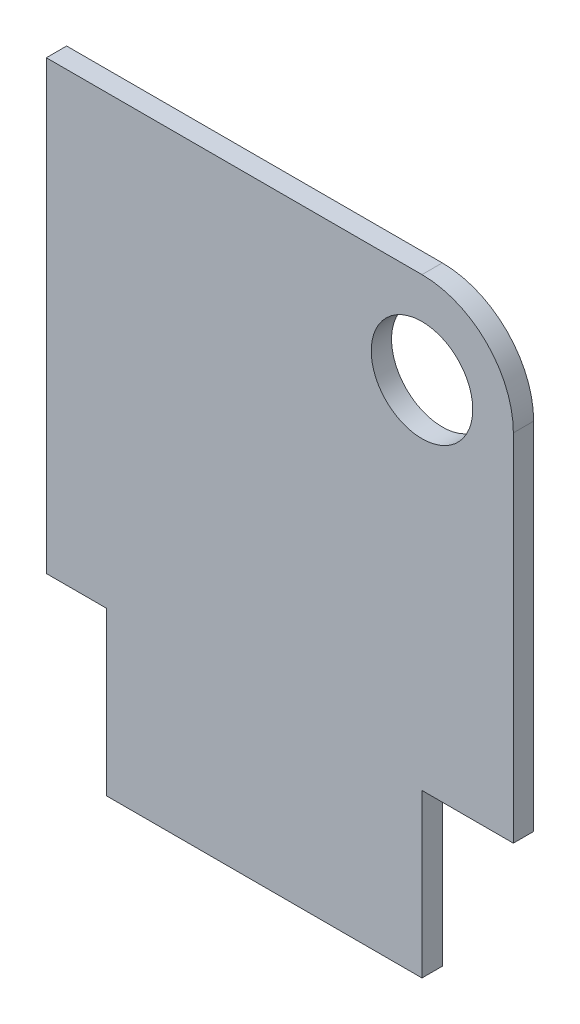
ISO-10303-21;
HEADER;
FILE_DESCRIPTION(('STEP AP214'),'2;1');
FILE_NAME('part.step','',(''),(''),'','','');
FILE_SCHEMA(('AUTOMOTIVE_DESIGN { 1 0 10303 214 1 1 1 1 }'));
ENDSEC;
DATA;
#1=APPLICATION_CONTEXT('core data for automotive mechanical design processes');
#2=APPLICATION_PROTOCOL_DEFINITION('international standard','automotive_design',2000,#1);
#3=PRODUCT_CONTEXT('',#1,'mechanical');
#4=PRODUCT('Part','Part','',(#3));
#5=PRODUCT_RELATED_PRODUCT_CATEGORY('part','',(#4));
#6=PRODUCT_DEFINITION_FORMATION('','',#4);
#7=PRODUCT_DEFINITION_CONTEXT('part definition',#1,'design');
#8=PRODUCT_DEFINITION('design','',#6,#7);
#9=PRODUCT_DEFINITION_SHAPE('','',#8);
#10=(LENGTH_UNIT() NAMED_UNIT(*) SI_UNIT(.MILLI.,.METRE.));
#11=(NAMED_UNIT(*) PLANE_ANGLE_UNIT() SI_UNIT($,.RADIAN.));
#12=(NAMED_UNIT(*) SI_UNIT($,.STERADIAN.) SOLID_ANGLE_UNIT());
#13=UNCERTAINTY_MEASURE_WITH_UNIT(LENGTH_MEASURE(1.E-05),#10,'distance_accuracy_value','');
#14=(GEOMETRIC_REPRESENTATION_CONTEXT(3) GLOBAL_UNCERTAINTY_ASSIGNED_CONTEXT((#13)) GLOBAL_UNIT_ASSIGNED_CONTEXT((#10,
#11,#12)) REPRESENTATION_CONTEXT('',''));
#15=CARTESIAN_POINT('',(0.,0.,0.));
#16=DIRECTION('',(0.,0.,1.));
#17=DIRECTION('',(1.,0.,0.));
#18=AXIS2_PLACEMENT_3D('',#15,#16,#17);
#19=CARTESIAN_POINT('',(0.,0.,10.));
#20=DIRECTION('',(-1.,0.,0.));
#21=DIRECTION('',(0.,0.,1.));
#22=AXIS2_PLACEMENT_3D('',#19,#20,#21);
#23=PLANE('',#22);
#24=DIRECTION('',(0.,1.,0.));
#25=VECTOR('',#24,1.);
#26=CARTESIAN_POINT('',(0.,0.,0.));
#27=LINE('',#26,#25);
#28=CARTESIAN_POINT('',(0.,80.,0.));
#29=VERTEX_POINT('',#28);
#30=CARTESIAN_POINT('',(0.,255.,0.));
#31=VERTEX_POINT('',#30);
#32=EDGE_CURVE('E155',#29,#31,#27,.T.);
#33=ORIENTED_EDGE('',*,*,#32,.T.);
#34=DIRECTION('',(0.,0.,-1.));
#35=VECTOR('',#34,1.);
#36=CARTESIAN_POINT('',(0.,255.,10.));
#37=LINE('',#36,#35);
#38=CARTESIAN_POINT('',(0.,255.,10.));
#39=VERTEX_POINT('',#38);
#40=EDGE_CURVE('E11',#39,#31,#37,.T.);
#41=ORIENTED_EDGE('',*,*,#40,.F.);
#42=DIRECTION('',(0.,1.,0.));
#43=VECTOR('',#42,1.);
#44=CARTESIAN_POINT('',(0.,0.,10.));
#45=LINE('',#44,#43);
#46=CARTESIAN_POINT('',(0.,80.,10.));
#47=VERTEX_POINT('',#46);
#48=EDGE_CURVE('E227',#47,#39,#45,.T.);
#49=ORIENTED_EDGE('',*,*,#48,.F.);
#50=DIRECTION('',(0.,0.,-1.));
#51=VECTOR('',#50,1.);
#52=CARTESIAN_POINT('',(0.,80.,10.));
#53=LINE('',#52,#51);
#54=EDGE_CURVE('E150',#47,#29,#53,.T.);
#55=ORIENTED_EDGE('',*,*,#54,.T.);
#56=EDGE_LOOP('',(#33,#41,#49,#55));
#57=FACE_BOUND('',#56,.T.);
#58=ADVANCED_FACE('F41',(#57),#23,.F.);
#59=CARTESIAN_POINT('',(-45.,255.,10.));
#60=DIRECTION('',(0.,0.,-1.));
#61=DIRECTION('',(-1.,0.,0.));
#62=AXIS2_PLACEMENT_3D('',#59,#60,#61);
#63=CYLINDRICAL_SURFACE('',#62,45.);
#64=CARTESIAN_POINT('',(-45.,255.,0.));
#65=DIRECTION('',(0.,0.,1.));
#66=DIRECTION('',(1.,0.,0.));
#67=AXIS2_PLACEMENT_3D('',#64,#65,#66);
#68=CIRCLE('',#67,45.);
#69=CARTESIAN_POINT('',(-45.,300.,0.));
#70=VERTEX_POINT('',#69);
#71=EDGE_CURVE('E159',#31,#70,#68,.T.);
#72=ORIENTED_EDGE('',*,*,#71,.T.);
#73=DIRECTION('',(0.,0.,-1.));
#74=VECTOR('',#73,1.);
#75=CARTESIAN_POINT('',(-45.,300.,10.));
#76=LINE('',#75,#74);
#77=CARTESIAN_POINT('',(-45.,300.,10.));
#78=VERTEX_POINT('',#77);
#79=EDGE_CURVE('E51',#78,#70,#76,.T.);
#80=ORIENTED_EDGE('',*,*,#79,.F.);
#81=CARTESIAN_POINT('',(-45.,255.,10.));
#82=DIRECTION('',(0.,0.,1.));
#83=DIRECTION('',(1.,0.,0.));
#84=AXIS2_PLACEMENT_3D('',#81,#82,#83);
#85=CIRCLE('',#84,45.);
#86=EDGE_CURVE('E104',#39,#78,#85,.T.);
#87=ORIENTED_EDGE('',*,*,#86,.F.);
#88=ORIENTED_EDGE('',*,*,#40,.T.);
#89=EDGE_LOOP('',(#72,#80,#87,#88));
#90=FACE_BOUND('',#89,.T.);
#91=ADVANCED_FACE('F247',(#90),#63,.T.);
#92=CARTESIAN_POINT('',(0.,300.,10.));
#93=DIRECTION('',(0.,-1.,0.));
#94=DIRECTION('',(1.,0.,0.));
#95=AXIS2_PLACEMENT_3D('',#92,#93,#94);
#96=PLANE('',#95);
#97=DIRECTION('',(-1.,0.,0.));
#98=VECTOR('',#97,1.);
#99=CARTESIAN_POINT('',(0.,300.,0.));
#100=LINE('',#99,#98);
#101=CARTESIAN_POINT('',(-230.,300.,0.));
#102=VERTEX_POINT('',#101);
#103=EDGE_CURVE('E162',#70,#102,#100,.T.);
#104=ORIENTED_EDGE('',*,*,#103,.T.);
#105=DIRECTION('',(0.,0.,-1.));
#106=VECTOR('',#105,1.);
#107=CARTESIAN_POINT('',(-230.,300.,10.));
#108=LINE('',#107,#106);
#109=CARTESIAN_POINT('',(-230.,300.,10.));
#110=VERTEX_POINT('',#109);
#111=EDGE_CURVE('E197',#110,#102,#108,.T.);
#112=ORIENTED_EDGE('',*,*,#111,.F.);
#113=DIRECTION('',(-1.,0.,0.));
#114=VECTOR('',#113,1.);
#115=CARTESIAN_POINT('',(0.,300.,10.));
#116=LINE('',#115,#114);
#117=EDGE_CURVE('E206',#78,#110,#116,.T.);
#118=ORIENTED_EDGE('',*,*,#117,.F.);
#119=ORIENTED_EDGE('',*,*,#79,.T.);
#120=EDGE_LOOP('',(#104,#112,#118,#119));
#121=FACE_BOUND('',#120,.T.);
#122=ADVANCED_FACE('F204',(#121),#96,.F.);
#123=CARTESIAN_POINT('',(-230.,0.,10.));
#124=DIRECTION('',(-1.,0.,0.));
#125=DIRECTION('',(0.,0.,1.));
#126=AXIS2_PLACEMENT_3D('',#123,#124,#125);
#127=PLANE('',#126);
#128=DIRECTION('',(0.,1.,0.));
#129=VECTOR('',#128,1.);
#130=CARTESIAN_POINT('',(-230.,0.,0.));
#131=LINE('',#130,#129);
#132=CARTESIAN_POINT('',(-230.,80.,0.));
#133=VERTEX_POINT('',#132);
#134=EDGE_CURVE('E166',#133,#102,#131,.T.);
#135=ORIENTED_EDGE('',*,*,#134,.F.);
#136=DIRECTION('',(0.,0.,-1.));
#137=VECTOR('',#136,1.);
#138=CARTESIAN_POINT('',(-230.,80.,10.));
#139=LINE('',#138,#137);
#140=CARTESIAN_POINT('',(-230.,80.,10.));
#141=VERTEX_POINT('',#140);
#142=EDGE_CURVE('E194',#141,#133,#139,.T.);
#143=ORIENTED_EDGE('',*,*,#142,.F.);
#144=DIRECTION('',(0.,1.,0.));
#145=VECTOR('',#144,1.);
#146=CARTESIAN_POINT('',(-230.,0.,10.));
#147=LINE('',#146,#145);
#148=EDGE_CURVE('E218',#141,#110,#147,.T.);
#149=ORIENTED_EDGE('',*,*,#148,.T.);
#150=ORIENTED_EDGE('',*,*,#111,.T.);
#151=EDGE_LOOP('',(#135,#143,#149,#150));
#152=FACE_BOUND('',#151,.T.);
#153=ADVANCED_FACE('F214',(#152),#127,.T.);
#154=CARTESIAN_POINT('',(0.,80.,10.));
#155=DIRECTION('',(0.,1.,0.));
#156=DIRECTION('',(0.,0.,1.));
#157=AXIS2_PLACEMENT_3D('',#154,#155,#156);
#158=PLANE('',#157);
#159=DIRECTION('',(1.,0.,0.));
#160=VECTOR('',#159,1.);
#161=CARTESIAN_POINT('',(0.,80.,0.));
#162=LINE('',#161,#160);
#163=CARTESIAN_POINT('',(-200.352260948772,80.,0.));
#164=VERTEX_POINT('',#163);
#165=EDGE_CURVE('E170',#133,#164,#162,.T.);
#166=ORIENTED_EDGE('',*,*,#165,.T.);
#167=DIRECTION('',(0.,0.,-1.));
#168=VECTOR('',#167,1.);
#169=CARTESIAN_POINT('',(-200.352260948772,80.,10.));
#170=LINE('',#169,#168);
#171=CARTESIAN_POINT('',(-200.352260948772,80.,10.));
#172=VERTEX_POINT('',#171);
#173=EDGE_CURVE('E190',#172,#164,#170,.T.);
#174=ORIENTED_EDGE('',*,*,#173,.F.);
#175=DIRECTION('',(1.,0.,0.));
#176=VECTOR('',#175,1.);
#177=CARTESIAN_POINT('',(0.,80.,10.));
#178=LINE('',#177,#176);
#179=EDGE_CURVE('E144',#141,#172,#178,.T.);
#180=ORIENTED_EDGE('',*,*,#179,.F.);
#181=ORIENTED_EDGE('',*,*,#142,.T.);
#182=EDGE_LOOP('',(#166,#174,#180,#181));
#183=FACE_BOUND('',#182,.T.);
#184=ADVANCED_FACE('F258',(#183),#158,.F.);
#185=CARTESIAN_POINT('',(-200.352260948772,0.,10.));
#186=DIRECTION('',(1.,0.,0.));
#187=DIRECTION('',(0.,0.,-1.));
#188=AXIS2_PLACEMENT_3D('',#185,#186,#187);
#189=PLANE('',#188);
#190=DIRECTION('',(0.,-1.,0.));
#191=VECTOR('',#190,1.);
#192=CARTESIAN_POINT('',(-200.352260948772,0.,0.));
#193=LINE('',#192,#191);
#194=CARTESIAN_POINT('',(-200.352260948772,0.,0.));
#195=VERTEX_POINT('',#194);
#196=EDGE_CURVE('E173',#164,#195,#193,.T.);
#197=ORIENTED_EDGE('',*,*,#196,.T.);
#198=DIRECTION('',(0.,0.,-1.));
#199=VECTOR('',#198,1.);
#200=CARTESIAN_POINT('',(-200.352260948772,0.,10.));
#201=LINE('',#200,#199);
#202=CARTESIAN_POINT('',(-200.352260948772,0.,10.));
#203=VERTEX_POINT('',#202);
#204=EDGE_CURVE('E130',#203,#195,#201,.T.);
#205=ORIENTED_EDGE('',*,*,#204,.F.);
#206=DIRECTION('',(0.,-1.,0.));
#207=VECTOR('',#206,1.);
#208=CARTESIAN_POINT('',(-200.352260948772,0.,10.));
#209=LINE('',#208,#207);
#210=EDGE_CURVE('E139',#172,#203,#209,.T.);
#211=ORIENTED_EDGE('',*,*,#210,.F.);
#212=ORIENTED_EDGE('',*,*,#173,.T.);
#213=EDGE_LOOP('',(#197,#205,#211,#212));
#214=FACE_BOUND('',#213,.T.);
#215=ADVANCED_FACE('F261',(#214),#189,.F.);
#216=CARTESIAN_POINT('',(0.,0.,10.));
#217=DIRECTION('',(0.,-1.,0.));
#218=DIRECTION('',(0.,0.,-1.));
#219=AXIS2_PLACEMENT_3D('',#216,#217,#218);
#220=PLANE('',#219);
#221=DIRECTION('',(-1.,0.,0.));
#222=VECTOR('',#221,1.);
#223=CARTESIAN_POINT('',(0.,0.,0.));
#224=LINE('',#223,#222);
#225=CARTESIAN_POINT('',(-45.,0.,0.));
#226=VERTEX_POINT('',#225);
#227=EDGE_CURVE('E128',#226,#195,#224,.T.);
#228=ORIENTED_EDGE('',*,*,#227,.F.);
#229=DIRECTION('',(0.,0.,-1.));
#230=VECTOR('',#229,1.);
#231=CARTESIAN_POINT('',(-45.,0.,10.));
#232=LINE('',#231,#230);
#233=CARTESIAN_POINT('',(-45.,0.,10.));
#234=VERTEX_POINT('',#233);
#235=EDGE_CURVE('E122',#234,#226,#232,.T.);
#236=ORIENTED_EDGE('',*,*,#235,.F.);
#237=DIRECTION('',(-1.,0.,0.));
#238=VECTOR('',#237,1.);
#239=CARTESIAN_POINT('',(0.,0.,10.));
#240=LINE('',#239,#238);
#241=EDGE_CURVE('E126',#234,#203,#240,.T.);
#242=ORIENTED_EDGE('',*,*,#241,.T.);
#243=ORIENTED_EDGE('',*,*,#204,.T.);
#244=EDGE_LOOP('',(#228,#236,#242,#243));
#245=FACE_BOUND('',#244,.T.);
#246=ADVANCED_FACE('F124',(#245),#220,.T.);
#247=CARTESIAN_POINT('',(-45.,0.,10.));
#248=DIRECTION('',(-1.,0.,0.));
#249=DIRECTION('',(0.,0.,1.));
#250=AXIS2_PLACEMENT_3D('',#247,#248,#249);
#251=PLANE('',#250);
#252=DIRECTION('',(0.,1.,0.));
#253=VECTOR('',#252,1.);
#254=CARTESIAN_POINT('',(-45.,0.,0.));
#255=LINE('',#254,#253);
#256=CARTESIAN_POINT('',(-45.,80.,0.));
#257=VERTEX_POINT('',#256);
#258=EDGE_CURVE('E90',#226,#257,#255,.T.);
#259=ORIENTED_EDGE('',*,*,#258,.T.);
#260=DIRECTION('',(0.,0.,-1.));
#261=VECTOR('',#260,1.);
#262=CARTESIAN_POINT('',(-45.,80.,10.));
#263=LINE('',#262,#261);
#264=CARTESIAN_POINT('',(-45.,80.,10.));
#265=VERTEX_POINT('',#264);
#266=EDGE_CURVE('E131',#265,#257,#263,.T.);
#267=ORIENTED_EDGE('',*,*,#266,.F.);
#268=DIRECTION('',(0.,1.,0.));
#269=VECTOR('',#268,1.);
#270=CARTESIAN_POINT('',(-45.,0.,10.));
#271=LINE('',#270,#269);
#272=EDGE_CURVE('E133',#234,#265,#271,.T.);
#273=ORIENTED_EDGE('',*,*,#272,.F.);
#274=ORIENTED_EDGE('',*,*,#235,.T.);
#275=EDGE_LOOP('',(#259,#267,#273,#274));
#276=FACE_BOUND('',#275,.T.);
#277=ADVANCED_FACE('F134',(#276),#251,.F.);
#278=CARTESIAN_POINT('',(-45.,255.,10.));
#279=DIRECTION('',(0.,0.,-1.));
#280=DIRECTION('',(-1.,0.,0.));
#281=AXIS2_PLACEMENT_3D('',#278,#279,#280);
#282=CYLINDRICAL_SURFACE('',#281,25.);
#283=CARTESIAN_POINT('',(-45.,255.,10.));
#284=DIRECTION('',(0.,0.,1.));
#285=DIRECTION('',(1.,0.,0.));
#286=AXIS2_PLACEMENT_3D('',#283,#284,#285);
#287=CIRCLE('',#286,25.);
#288=CARTESIAN_POINT('',(-20.,255.,10.));
#289=VERTEX_POINT('',#288);
#290=EDGE_CURVE('E183',#289,#289,#287,.T.);
#291=ORIENTED_EDGE('',*,*,#290,.T.);
#292=EDGE_LOOP('',(#291));
#293=FACE_BOUND('',#292,.T.);
#294=CARTESIAN_POINT('',(-45.,255.,0.));
#295=DIRECTION('',(0.,0.,1.));
#296=DIRECTION('',(1.,0.,0.));
#297=AXIS2_PLACEMENT_3D('',#294,#295,#296);
#298=CIRCLE('',#297,25.);
#299=CARTESIAN_POINT('',(-20.,255.,0.));
#300=VERTEX_POINT('',#299);
#301=EDGE_CURVE('E151',#300,#300,#298,.T.);
#302=ORIENTED_EDGE('',*,*,#301,.F.);
#303=EDGE_LOOP('',(#302));
#304=FACE_BOUND('',#303,.T.);
#305=ADVANCED_FACE('F43',(#293,#304),#282,.F.);
#306=CARTESIAN_POINT('',(0.,80.,10.));
#307=DIRECTION('',(0.,1.,0.));
#308=DIRECTION('',(0.,0.,1.));
#309=AXIS2_PLACEMENT_3D('',#306,#307,#308);
#310=PLANE('',#309);
#311=DIRECTION('',(1.,0.,0.));
#312=VECTOR('',#311,1.);
#313=CARTESIAN_POINT('',(0.,80.,0.));
#314=LINE('',#313,#312);
#315=EDGE_CURVE('E96',#257,#29,#314,.T.);
#316=ORIENTED_EDGE('',*,*,#315,.T.);
#317=ORIENTED_EDGE('',*,*,#54,.F.);
#318=DIRECTION('',(1.,0.,0.));
#319=VECTOR('',#318,1.);
#320=CARTESIAN_POINT('',(0.,80.,10.));
#321=LINE('',#320,#319);
#322=EDGE_CURVE('E59',#265,#47,#321,.T.);
#323=ORIENTED_EDGE('',*,*,#322,.F.);
#324=ORIENTED_EDGE('',*,*,#266,.T.);
#325=EDGE_LOOP('',(#316,#317,#323,#324));
#326=FACE_BOUND('',#325,.T.);
#327=ADVANCED_FACE('F237',(#326),#310,.F.);
#328=CARTESIAN_POINT('',(0.,0.,10.));
#329=DIRECTION('',(0.,0.,1.));
#330=DIRECTION('',(1.,0.,0.));
#331=AXIS2_PLACEMENT_3D('',#328,#329,#330);
#332=PLANE('',#331);
#333=ORIENTED_EDGE('',*,*,#290,.F.);
#334=EDGE_LOOP('',(#333));
#335=FACE_BOUND('',#334,.T.);
#336=ORIENTED_EDGE('',*,*,#48,.T.);
#337=ORIENTED_EDGE('',*,*,#86,.T.);
#338=ORIENTED_EDGE('',*,*,#117,.T.);
#339=ORIENTED_EDGE('',*,*,#148,.F.);
#340=ORIENTED_EDGE('',*,*,#179,.T.);
#341=ORIENTED_EDGE('',*,*,#210,.T.);
#342=ORIENTED_EDGE('',*,*,#241,.F.);
#343=ORIENTED_EDGE('',*,*,#272,.T.);
#344=ORIENTED_EDGE('',*,*,#322,.T.);
#345=EDGE_LOOP('',(#336,#337,#338,#339,#340,#341,#342,#343,#344));
#346=FACE_BOUND('',#345,.T.);
#347=ADVANCED_FACE('F137',(#335,#346),#332,.T.);
#348=CARTESIAN_POINT('',(0.,0.,0.));
#349=DIRECTION('',(0.,0.,1.));
#350=DIRECTION('',(1.,0.,0.));
#351=AXIS2_PLACEMENT_3D('',#348,#349,#350);
#352=PLANE('',#351);
#353=ORIENTED_EDGE('',*,*,#301,.T.);
#354=EDGE_LOOP('',(#353));
#355=FACE_BOUND('',#354,.T.);
#356=ORIENTED_EDGE('',*,*,#32,.F.);
#357=ORIENTED_EDGE('',*,*,#315,.F.);
#358=ORIENTED_EDGE('',*,*,#258,.F.);
#359=ORIENTED_EDGE('',*,*,#227,.T.);
#360=ORIENTED_EDGE('',*,*,#196,.F.);
#361=ORIENTED_EDGE('',*,*,#165,.F.);
#362=ORIENTED_EDGE('',*,*,#134,.T.);
#363=ORIENTED_EDGE('',*,*,#103,.F.);
#364=ORIENTED_EDGE('',*,*,#71,.F.);
#365=EDGE_LOOP('',(#356,#357,#358,#359,#360,#361,#362,#363,#364));
#366=FACE_BOUND('',#365,.T.);
#367=ADVANCED_FACE('F209',(#355,#366),#352,.F.);
#368=CLOSED_SHELL('',(#58,#91,#122,#153,#184,#215,#246,#277,#305,#327,#347,#367));
#369=MANIFOLD_SOLID_BREP('B2',#368);
#370=ADVANCED_BREP_SHAPE_REPRESENTATION('',(#18,#369),#14);
#371=SHAPE_DEFINITION_REPRESENTATION(#9,#370);
ENDSEC;
END-ISO-10303-21;
